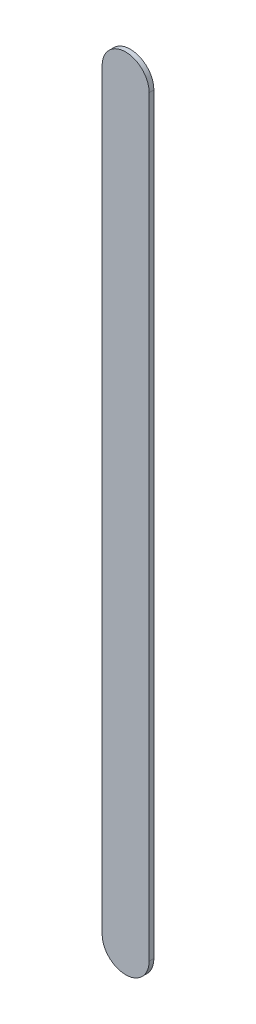
ISO-10303-21;
HEADER;
FILE_DESCRIPTION(('STEP AP214'),'2;1');
FILE_NAME('part.step','',(''),(''),'','','');
FILE_SCHEMA(('AUTOMOTIVE_DESIGN { 1 0 10303 214 1 1 1 1 }'));
ENDSEC;
DATA;
#1=APPLICATION_CONTEXT('core data for automotive mechanical design processes');
#2=APPLICATION_PROTOCOL_DEFINITION('international standard','automotive_design',2000,#1);
#3=PRODUCT_CONTEXT('',#1,'mechanical');
#4=PRODUCT('Part','Part','',(#3));
#5=PRODUCT_RELATED_PRODUCT_CATEGORY('part','',(#4));
#6=PRODUCT_DEFINITION_FORMATION('','',#4);
#7=PRODUCT_DEFINITION_CONTEXT('part definition',#1,'design');
#8=PRODUCT_DEFINITION('design','',#6,#7);
#9=PRODUCT_DEFINITION_SHAPE('','',#8);
#10=(LENGTH_UNIT() NAMED_UNIT(*) SI_UNIT(.MILLI.,.METRE.));
#11=(NAMED_UNIT(*) PLANE_ANGLE_UNIT() SI_UNIT($,.RADIAN.));
#12=(NAMED_UNIT(*) SI_UNIT($,.STERADIAN.) SOLID_ANGLE_UNIT());
#13=UNCERTAINTY_MEASURE_WITH_UNIT(LENGTH_MEASURE(1.E-05),#10,'distance_accuracy_value','');
#14=(GEOMETRIC_REPRESENTATION_CONTEXT(3) GLOBAL_UNCERTAINTY_ASSIGNED_CONTEXT((#13)) GLOBAL_UNIT_ASSIGNED_CONTEXT((#10,
#11,#12)) REPRESENTATION_CONTEXT('',''));
#15=CARTESIAN_POINT('',(0.,0.,0.));
#16=DIRECTION('',(0.,0.,1.));
#17=DIRECTION('',(1.,0.,0.));
#18=AXIS2_PLACEMENT_3D('',#15,#16,#17);
#19=CARTESIAN_POINT('',(17.950999755859,36.399998779297,0.0127));
#20=DIRECTION('',(0.,0.,1.));
#21=DIRECTION('',(1.,0.,0.));
#22=AXIS2_PLACEMENT_3D('',#19,#20,#21);
#23=PLANE('',#22);
#24=CARTESIAN_POINT('',(17.950999755859,37.415999755848,0.0127));
#25=DIRECTION('',(0.,0.,-1.));
#26=DIRECTION('',(1.,0.,0.));
#27=AXIS2_PLACEMENT_3D('',#24,#25,#26);
#28=CIRCLE('',#27,0.06349975587111);
#29=CARTESIAN_POINT('',(17.8875,37.415999145502,0.0127));
#30=VERTEX_POINT('',#29);
#31=CARTESIAN_POINT('',(18.014499511725,37.415999755848,0.0127));
#32=VERTEX_POINT('',#31);
#33=EDGE_CURVE('E72',#30,#32,#28,.T.);
#34=ORIENTED_EDGE('',*,*,#33,.F.);
#35=DIRECTION('',(0.,-1.,0.));
#36=VECTOR('',#35,1.);
#37=CARTESIAN_POINT('',(17.8875,35.383999023438,0.0127));
#38=LINE('',#37,#36);
#39=CARTESIAN_POINT('',(17.887499999994,35.383997802746,0.0127));
#40=VERTEX_POINT('',#39);
#41=EDGE_CURVE('E21',#30,#40,#38,.T.);
#42=ORIENTED_EDGE('',*,*,#41,.T.);
#43=CARTESIAN_POINT('',(17.950999755859,35.383997802746,0.0127));
#44=DIRECTION('',(0.,0.,1.));
#45=DIRECTION('',(1.,0.,0.));
#46=AXIS2_PLACEMENT_3D('',#43,#44,#45);
#47=CIRCLE('',#46,0.06349975587111);
#48=CARTESIAN_POINT('',(18.014499511725,35.383997802746,0.0127));
#49=VERTEX_POINT('',#48);
#50=EDGE_CURVE('E99',#40,#49,#47,.T.);
#51=ORIENTED_EDGE('',*,*,#50,.T.);
#52=DIRECTION('',(0.,1.,0.));
#53=VECTOR('',#52,1.);
#54=CARTESIAN_POINT('',(18.014499511719,37.415998535156,0.0127));
#55=LINE('',#54,#53);
#56=EDGE_CURVE('E11',#49,#32,#55,.T.);
#57=ORIENTED_EDGE('',*,*,#56,.T.);
#58=EDGE_LOOP('',(#34,#42,#51,#57));
#59=FACE_BOUND('',#58,.T.);
#60=ADVANCED_FACE('F17',(#59),#23,.T.);
#61=CARTESIAN_POINT('',(18.014499511719,37.415998535156,0.));
#62=DIRECTION('',(-1.,0.,0.));
#63=DIRECTION('',(0.,0.,1.));
#64=AXIS2_PLACEMENT_3D('',#61,#62,#63);
#65=PLANE('',#64);
#66=DIRECTION('',(0.,0.,1.));
#67=VECTOR('',#66,1.);
#68=CARTESIAN_POINT('',(18.014499511731,35.383997802746,0.));
#69=LINE('',#68,#67);
#70=CARTESIAN_POINT('',(18.014499511725,35.383997802746,0.));
#71=VERTEX_POINT('',#70);
#72=EDGE_CURVE('E80',#71,#49,#69,.T.);
#73=ORIENTED_EDGE('',*,*,#72,.F.);
#74=DIRECTION('',(0.,1.,0.));
#75=VECTOR('',#74,1.);
#76=CARTESIAN_POINT('',(18.014499511719,36.399998779297,0.));
#77=LINE('',#76,#75);
#78=CARTESIAN_POINT('',(18.014499511725,37.415999755848,0.));
#79=VERTEX_POINT('',#78);
#80=EDGE_CURVE('E77',#71,#79,#77,.T.);
#81=ORIENTED_EDGE('',*,*,#80,.T.);
#82=DIRECTION('',(0.,0.,-1.));
#83=VECTOR('',#82,1.);
#84=CARTESIAN_POINT('',(18.014499511731,37.415999755848,0.));
#85=LINE('',#84,#83);
#86=EDGE_CURVE('E28',#32,#79,#85,.T.);
#87=ORIENTED_EDGE('',*,*,#86,.F.);
#88=ORIENTED_EDGE('',*,*,#56,.F.);
#89=EDGE_LOOP('',(#73,#81,#87,#88));
#90=FACE_BOUND('',#89,.T.);
#91=ADVANCED_FACE('F78',(#90),#65,.F.);
#92=CARTESIAN_POINT('',(17.950999755859,37.415999755848,0.));
#93=DIRECTION('',(0.,0.,1.));
#94=DIRECTION('',(1.,0.,0.));
#95=AXIS2_PLACEMENT_3D('',#92,#93,#94);
#96=CYLINDRICAL_SURFACE('',#95,0.06349975587111);
#97=DIRECTION('',(0.,0.,1.));
#98=VECTOR('',#97,1.);
#99=CARTESIAN_POINT('',(17.8875,37.415998535156,0.));
#100=LINE('',#99,#98);
#101=CARTESIAN_POINT('',(17.8875,37.415999145502,0.));
#102=VERTEX_POINT('',#101);
#103=EDGE_CURVE('E102',#102,#30,#100,.T.);
#104=ORIENTED_EDGE('',*,*,#103,.T.);
#105=ORIENTED_EDGE('',*,*,#33,.T.);
#106=ORIENTED_EDGE('',*,*,#86,.T.);
#107=CARTESIAN_POINT('',(17.950999755859,37.415999755848,0.));
#108=DIRECTION('',(0.,0.,1.));
#109=DIRECTION('',(1.,0.,0.));
#110=AXIS2_PLACEMENT_3D('',#107,#108,#109);
#111=CIRCLE('',#110,0.06349975587111);
#112=EDGE_CURVE('E70',#79,#102,#111,.T.);
#113=ORIENTED_EDGE('',*,*,#112,.T.);
#114=EDGE_LOOP('',(#104,#105,#106,#113));
#115=FACE_BOUND('',#114,.T.);
#116=ADVANCED_FACE('F19',(#115),#96,.T.);
#117=CARTESIAN_POINT('',(17.8875,35.383999023438,0.));
#118=DIRECTION('',(1.,0.,0.));
#119=DIRECTION('',(0.,1.,0.));
#120=AXIS2_PLACEMENT_3D('',#117,#118,#119);
#121=PLANE('',#120);
#122=ORIENTED_EDGE('',*,*,#103,.F.);
#123=DIRECTION('',(0.,-1.,0.));
#124=VECTOR('',#123,1.);
#125=CARTESIAN_POINT('',(17.8875,36.399998779297,0.));
#126=LINE('',#125,#124);
#127=CARTESIAN_POINT('',(17.887499999994,35.383997802746,0.));
#128=VERTEX_POINT('',#127);
#129=EDGE_CURVE('E89',#102,#128,#126,.T.);
#130=ORIENTED_EDGE('',*,*,#129,.T.);
#131=DIRECTION('',(0.,0.,-1.));
#132=VECTOR('',#131,1.);
#133=CARTESIAN_POINT('',(17.887499999988,35.383997802746,0.));
#134=LINE('',#133,#132);
#135=EDGE_CURVE('E101',#40,#128,#134,.T.);
#136=ORIENTED_EDGE('',*,*,#135,.F.);
#137=ORIENTED_EDGE('',*,*,#41,.F.);
#138=EDGE_LOOP('',(#122,#130,#136,#137));
#139=FACE_BOUND('',#138,.T.);
#140=ADVANCED_FACE('F125',(#139),#121,.F.);
#141=CARTESIAN_POINT('',(17.950999755859,35.383997802746,0.));
#142=DIRECTION('',(0.,0.,1.));
#143=DIRECTION('',(1.,0.,0.));
#144=AXIS2_PLACEMENT_3D('',#141,#142,#143);
#145=CYLINDRICAL_SURFACE('',#144,0.06349975587111);
#146=ORIENTED_EDGE('',*,*,#72,.T.);
#147=ORIENTED_EDGE('',*,*,#50,.F.);
#148=ORIENTED_EDGE('',*,*,#135,.T.);
#149=CARTESIAN_POINT('',(17.950999755859,35.383997802746,0.));
#150=DIRECTION('',(0.,0.,1.));
#151=DIRECTION('',(1.,0.,0.));
#152=AXIS2_PLACEMENT_3D('',#149,#150,#151);
#153=CIRCLE('',#152,0.06349975587111);
#154=EDGE_CURVE('E85',#128,#71,#153,.T.);
#155=ORIENTED_EDGE('',*,*,#154,.T.);
#156=EDGE_LOOP('',(#146,#147,#148,#155));
#157=FACE_BOUND('',#156,.T.);
#158=ADVANCED_FACE('F122',(#157),#145,.T.);
#159=CARTESIAN_POINT('',(17.950999755859,36.399998779297,0.));
#160=DIRECTION('',(0.,0.,1.));
#161=DIRECTION('',(1.,0.,0.));
#162=AXIS2_PLACEMENT_3D('',#159,#160,#161);
#163=PLANE('',#162);
#164=ORIENTED_EDGE('',*,*,#129,.F.);
#165=ORIENTED_EDGE('',*,*,#112,.F.);
#166=ORIENTED_EDGE('',*,*,#80,.F.);
#167=ORIENTED_EDGE('',*,*,#154,.F.);
#168=EDGE_LOOP('',(#164,#165,#166,#167));
#169=FACE_BOUND('',#168,.T.);
#170=ADVANCED_FACE('F87',(#169),#163,.F.);
#171=CLOSED_SHELL('',(#60,#91,#116,#140,#158,#170));
#172=MANIFOLD_SOLID_BREP('B1',#171);
#173=ADVANCED_BREP_SHAPE_REPRESENTATION('',(#18,#172),#14);
#174=SHAPE_DEFINITION_REPRESENTATION(#9,#173);
ENDSEC;
END-ISO-10303-21;
